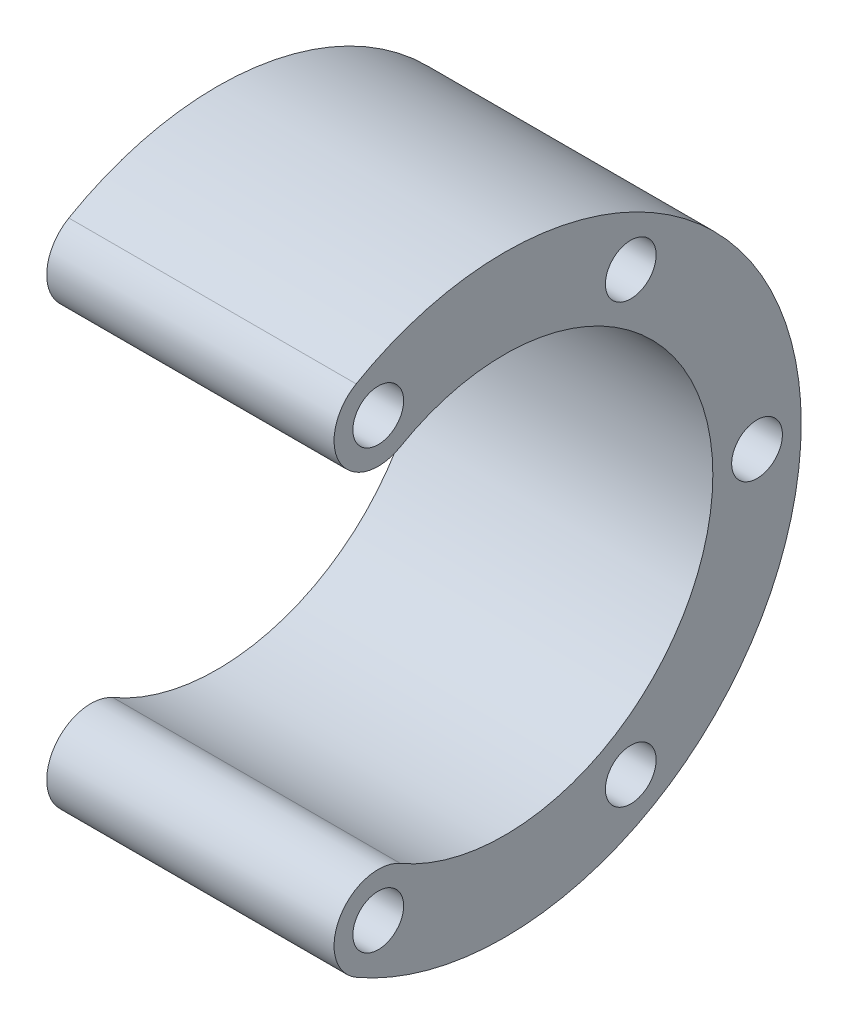
ISO-10303-21;
HEADER;
FILE_DESCRIPTION(('STEP AP214'),'2;1');
FILE_NAME('part.step','',(''),(''),'','','');
FILE_SCHEMA(('AUTOMOTIVE_DESIGN { 1 0 10303 214 1 1 1 1 }'));
ENDSEC;
DATA;
#1=APPLICATION_CONTEXT('core data for automotive mechanical design processes');
#2=APPLICATION_PROTOCOL_DEFINITION('international standard','automotive_design',2000,#1);
#3=PRODUCT_CONTEXT('',#1,'mechanical');
#4=PRODUCT('Part','Part','',(#3));
#5=PRODUCT_RELATED_PRODUCT_CATEGORY('part','',(#4));
#6=PRODUCT_DEFINITION_FORMATION('','',#4);
#7=PRODUCT_DEFINITION_CONTEXT('part definition',#1,'design');
#8=PRODUCT_DEFINITION('design','',#6,#7);
#9=PRODUCT_DEFINITION_SHAPE('','',#8);
#10=(LENGTH_UNIT() NAMED_UNIT(*) SI_UNIT(.MILLI.,.METRE.));
#11=(NAMED_UNIT(*) PLANE_ANGLE_UNIT() SI_UNIT($,.RADIAN.));
#12=(NAMED_UNIT(*) SI_UNIT($,.STERADIAN.) SOLID_ANGLE_UNIT());
#13=UNCERTAINTY_MEASURE_WITH_UNIT(LENGTH_MEASURE(1.E-05),#10,'distance_accuracy_value','');
#14=(GEOMETRIC_REPRESENTATION_CONTEXT(3) GLOBAL_UNCERTAINTY_ASSIGNED_CONTEXT((#13)) GLOBAL_UNIT_ASSIGNED_CONTEXT((#10,
#11,#12)) REPRESENTATION_CONTEXT('',''));
#15=CARTESIAN_POINT('',(0.,0.,0.));
#16=DIRECTION('',(0.,0.,1.));
#17=DIRECTION('',(1.,0.,0.));
#18=AXIS2_PLACEMENT_3D('',#15,#16,#17);
#19=CARTESIAN_POINT('',(285.75,300.961950573943,366.715339333629));
#20=DIRECTION('',(-1.,0.,0.));
#21=DIRECTION('',(0.,-1.,0.));
#22=AXIS2_PLACEMENT_3D('',#19,#20,#21);
#23=PLANE('',#22);
#24=CARTESIAN_POINT('',(285.75,279.691454743875,317.765339333629));
#25=DIRECTION('',(-1.,0.,0.));
#26=DIRECTION('',(0.,-1.,0.));
#27=AXIS2_PLACEMENT_3D('',#24,#25,#26);
#28=CIRCLE('',#27,2.5527);
#29=CARTESIAN_POINT('',(285.75,277.138754743875,317.765339333629));
#30=VERTEX_POINT('',#29);
#31=EDGE_CURVE('E136',#30,#30,#28,.F.);
#32=ORIENTED_EDGE('',*,*,#31,.T.);
#33=EDGE_LOOP('',(#32));
#34=FACE_BOUND('',#33,.T.);
#35=CARTESIAN_POINT('',(285.75,323.685545256125,343.165339333629));
#36=DIRECTION('',(-1.,0.,0.));
#37=DIRECTION('',(0.,-1.,0.));
#38=AXIS2_PLACEMENT_3D('',#35,#36,#37);
#39=CIRCLE('',#38,2.5527);
#40=CARTESIAN_POINT('',(285.75,321.132845256124,343.165339333629));
#41=VERTEX_POINT('',#40);
#42=EDGE_CURVE('E144',#41,#41,#39,.F.);
#43=ORIENTED_EDGE('',*,*,#42,.T.);
#44=EDGE_LOOP('',(#43));
#45=FACE_BOUND('',#44,.T.);
#46=CARTESIAN_POINT('',(285.75,279.691454743875,343.165339333629));
#47=DIRECTION('',(-1.,0.,0.));
#48=DIRECTION('',(0.,-1.,0.));
#49=AXIS2_PLACEMENT_3D('',#46,#47,#48);
#50=CIRCLE('',#49,2.5527);
#51=CARTESIAN_POINT('',(285.75,277.138754743875,343.165339333629));
#52=VERTEX_POINT('',#51);
#53=EDGE_CURVE('E125',#52,#52,#50,.F.);
#54=ORIENTED_EDGE('',*,*,#53,.T.);
#55=EDGE_LOOP('',(#54));
#56=FACE_BOUND('',#55,.T.);
#57=CARTESIAN_POINT('',(285.75,323.685545256125,343.165339333629));
#58=DIRECTION('',(-1.,0.,0.));
#59=DIRECTION('',(0.,-1.,0.));
#60=AXIS2_PLACEMENT_3D('',#57,#58,#59);
#61=CIRCLE('',#60,4.445);
#62=CARTESIAN_POINT('',(285.75,327.535028175946,345.387839333629));
#63=VERTEX_POINT('',#62);
#64=CARTESIAN_POINT('',(285.75,319.836062336302,340.942839333629));
#65=VERTEX_POINT('',#64);
#66=EDGE_CURVE('E131',#63,#65,#61,.F.);
#67=ORIENTED_EDGE('',*,*,#66,.F.);
#68=CARTESIAN_POINT('',(285.75,301.6885,330.465339333629));
#69=DIRECTION('',(-1.,0.,0.));
#70=DIRECTION('',(0.,-1.,0.));
#71=AXIS2_PLACEMENT_3D('',#68,#69,#70);
#72=CIRCLE('',#71,29.845);
#73=CARTESIAN_POINT('',(285.75,275.841971824053,345.387839333629));
#74=VERTEX_POINT('',#73);
#75=EDGE_CURVE('E92',#63,#74,#72,.T.);
#76=ORIENTED_EDGE('',*,*,#75,.T.);
#77=CARTESIAN_POINT('',(285.75,279.691454743875,343.165339333629));
#78=DIRECTION('',(-1.,0.,0.));
#79=DIRECTION('',(0.,-1.,0.));
#80=AXIS2_PLACEMENT_3D('',#77,#78,#79);
#81=CIRCLE('',#80,4.44499999999995);
#82=CARTESIAN_POINT('',(285.75,283.540937663696,340.942839333629));
#83=VERTEX_POINT('',#82);
#84=EDGE_CURVE('E128',#83,#74,#81,.F.);
#85=ORIENTED_EDGE('',*,*,#84,.F.);
#86=CARTESIAN_POINT('',(285.75,301.6885,330.465339333629));
#87=DIRECTION('',(-1.,0.,0.));
#88=DIRECTION('',(0.,-1.,0.));
#89=AXIS2_PLACEMENT_3D('',#86,#87,#88);
#90=CIRCLE('',#89,20.955);
#91=EDGE_CURVE('E61',#65,#83,#90,.T.);
#92=ORIENTED_EDGE('',*,*,#91,.F.);
#93=EDGE_LOOP('',(#67,#76,#85,#92));
#94=FACE_BOUND('',#93,.T.);
#95=CARTESIAN_POINT('',(285.75,301.6885,305.065339333629));
#96=DIRECTION('',(-1.,0.,0.));
#97=DIRECTION('',(0.,-1.,0.));
#98=AXIS2_PLACEMENT_3D('',#95,#96,#97);
#99=CIRCLE('',#98,2.5527);
#100=CARTESIAN_POINT('',(285.75,299.1358,305.065339333629));
#101=VERTEX_POINT('',#100);
#102=EDGE_CURVE('E148',#101,#101,#99,.F.);
#103=ORIENTED_EDGE('',*,*,#102,.T.);
#104=EDGE_LOOP('',(#103));
#105=FACE_BOUND('',#104,.T.);
#106=CARTESIAN_POINT('',(285.75,323.685545256125,317.765339333629));
#107=DIRECTION('',(-1.,0.,0.));
#108=DIRECTION('',(0.,-1.,0.));
#109=AXIS2_PLACEMENT_3D('',#106,#107,#108);
#110=CIRCLE('',#109,2.5527);
#111=CARTESIAN_POINT('',(285.75,321.132845256124,317.765339333629));
#112=VERTEX_POINT('',#111);
#113=EDGE_CURVE('E140',#112,#112,#110,.F.);
#114=ORIENTED_EDGE('',*,*,#113,.T.);
#115=EDGE_LOOP('',(#114));
#116=FACE_BOUND('',#115,.T.);
#117=ADVANCED_FACE('F45',(#34,#45,#56,#94,#105,#116),#23,.T.);
#118=CARTESIAN_POINT('',(285.748,301.6885,330.465339333629));
#119=DIRECTION('',(1.,0.,0.));
#120=DIRECTION('',(0.,1.,0.));
#121=AXIS2_PLACEMENT_3D('',#118,#119,#120);
#122=CYLINDRICAL_SURFACE('',#121,29.845);
#123=ORIENTED_EDGE('',*,*,#75,.F.);
#124=DIRECTION('',(1.,0.,0.));
#125=VECTOR('',#124,1.);
#126=CARTESIAN_POINT('',(285.748,327.535028175946,345.387839333629));
#127=LINE('',#126,#125);
#128=CARTESIAN_POINT('',(314.65,327.535028175946,345.387839333629));
#129=VERTEX_POINT('',#128);
#130=EDGE_CURVE('E85',#63,#129,#127,.T.);
#131=ORIENTED_EDGE('',*,*,#130,.T.);
#132=CARTESIAN_POINT('',(314.65,301.6885,330.465339333629));
#133=DIRECTION('',(1.,0.,0.));
#134=DIRECTION('',(0.,1.,0.));
#135=AXIS2_PLACEMENT_3D('',#132,#133,#134);
#136=CIRCLE('',#135,29.8449999999999);
#137=CARTESIAN_POINT('',(314.65,275.841971824053,345.387839333629));
#138=VERTEX_POINT('',#137);
#139=EDGE_CURVE('E90',#138,#129,#136,.T.);
#140=ORIENTED_EDGE('',*,*,#139,.F.);
#141=DIRECTION('',(1.,0.,0.));
#142=VECTOR('',#141,1.);
#143=CARTESIAN_POINT('',(285.748,275.841971824053,345.387839333629));
#144=LINE('',#143,#142);
#145=EDGE_CURVE('E95',#74,#138,#144,.T.);
#146=ORIENTED_EDGE('',*,*,#145,.F.);
#147=EDGE_LOOP('',(#123,#131,#140,#146));
#148=FACE_BOUND('',#147,.T.);
#149=ADVANCED_FACE('F87',(#148),#122,.T.);
#150=CARTESIAN_POINT('',(285.748,279.691454743875,343.165339333629));
#151=DIRECTION('',(1.,0.,0.));
#152=DIRECTION('',(0.,1.,0.));
#153=AXIS2_PLACEMENT_3D('',#150,#151,#152);
#154=CYLINDRICAL_SURFACE('',#153,4.44499999999995);
#155=DIRECTION('',(1.,0.,0.));
#156=VECTOR('',#155,1.);
#157=CARTESIAN_POINT('',(285.748,283.540937663696,340.942839333629));
#158=LINE('',#157,#156);
#159=CARTESIAN_POINT('',(314.65,283.540937663697,340.942839333629));
#160=VERTEX_POINT('',#159);
#161=EDGE_CURVE('E54',#83,#160,#158,.T.);
#162=ORIENTED_EDGE('',*,*,#161,.F.);
#163=ORIENTED_EDGE('',*,*,#84,.T.);
#164=ORIENTED_EDGE('',*,*,#145,.T.);
#165=CARTESIAN_POINT('',(314.65,279.691454743875,343.165339333629));
#166=DIRECTION('',(1.,0.,0.));
#167=DIRECTION('',(0.,1.,0.));
#168=AXIS2_PLACEMENT_3D('',#165,#166,#167);
#169=CIRCLE('',#168,4.44500000000001);
#170=EDGE_CURVE('E110',#160,#138,#169,.T.);
#171=ORIENTED_EDGE('',*,*,#170,.F.);
#172=EDGE_LOOP('',(#162,#163,#164,#171));
#173=FACE_BOUND('',#172,.T.);
#174=ADVANCED_FACE('F159',(#173),#154,.T.);
#175=CARTESIAN_POINT('',(285.748,323.685545256125,343.165339333629));
#176=DIRECTION('',(1.,0.,0.));
#177=DIRECTION('',(0.,1.,0.));
#178=AXIS2_PLACEMENT_3D('',#175,#176,#177);
#179=CYLINDRICAL_SURFACE('',#178,4.445);
#180=ORIENTED_EDGE('',*,*,#130,.F.);
#181=ORIENTED_EDGE('',*,*,#66,.T.);
#182=DIRECTION('',(1.,0.,0.));
#183=VECTOR('',#182,1.);
#184=CARTESIAN_POINT('',(285.748,319.836062336302,340.942839333629));
#185=LINE('',#184,#183);
#186=CARTESIAN_POINT('',(314.65,319.836062336303,340.942839333629));
#187=VERTEX_POINT('',#186);
#188=EDGE_CURVE('E11',#65,#187,#185,.T.);
#189=ORIENTED_EDGE('',*,*,#188,.T.);
#190=CARTESIAN_POINT('',(314.65,323.685545256125,343.165339333629));
#191=DIRECTION('',(1.,0.,0.));
#192=DIRECTION('',(0.,1.,0.));
#193=AXIS2_PLACEMENT_3D('',#190,#191,#192);
#194=CIRCLE('',#193,4.44499999999994);
#195=EDGE_CURVE('E98',#129,#187,#194,.T.);
#196=ORIENTED_EDGE('',*,*,#195,.F.);
#197=EDGE_LOOP('',(#180,#181,#189,#196));
#198=FACE_BOUND('',#197,.T.);
#199=ADVANCED_FACE('F99',(#198),#179,.T.);
#200=CARTESIAN_POINT('',(285.748,301.6885,330.465339333629));
#201=DIRECTION('',(1.,0.,0.));
#202=DIRECTION('',(0.,1.,0.));
#203=AXIS2_PLACEMENT_3D('',#200,#201,#202);
#204=CYLINDRICAL_SURFACE('',#203,20.955);
#205=ORIENTED_EDGE('',*,*,#188,.F.);
#206=ORIENTED_EDGE('',*,*,#91,.T.);
#207=ORIENTED_EDGE('',*,*,#161,.T.);
#208=CARTESIAN_POINT('',(314.65,301.6885,330.465339333629));
#209=DIRECTION('',(-1.,0.,0.));
#210=DIRECTION('',(0.,1.,0.));
#211=AXIS2_PLACEMENT_3D('',#208,#209,#210);
#212=CIRCLE('',#211,20.955);
#213=EDGE_CURVE('E104',#187,#160,#212,.T.);
#214=ORIENTED_EDGE('',*,*,#213,.F.);
#215=EDGE_LOOP('',(#205,#206,#207,#214));
#216=FACE_BOUND('',#215,.T.);
#217=ADVANCED_FACE('F47',(#216),#204,.F.);
#218=CARTESIAN_POINT('',(285.748,279.691454743875,343.165339333629));
#219=DIRECTION('',(1.,0.,0.));
#220=DIRECTION('',(0.,1.,0.));
#221=AXIS2_PLACEMENT_3D('',#218,#219,#220);
#222=CYLINDRICAL_SURFACE('',#221,2.5527);
#223=ORIENTED_EDGE('',*,*,#53,.F.);
#224=EDGE_LOOP('',(#223));
#225=FACE_BOUND('',#224,.T.);
#226=CARTESIAN_POINT('',(314.65,279.691454743875,343.165339333629));
#227=DIRECTION('',(1.,0.,0.));
#228=DIRECTION('',(0.,1.,0.));
#229=AXIS2_PLACEMENT_3D('',#226,#227,#228);
#230=CIRCLE('',#229,2.55270000000003);
#231=CARTESIAN_POINT('',(314.65,282.244154743875,343.165339333629));
#232=VERTEX_POINT('',#231);
#233=EDGE_CURVE('E112',#232,#232,#230,.T.);
#234=ORIENTED_EDGE('',*,*,#233,.T.);
#235=EDGE_LOOP('',(#234));
#236=FACE_BOUND('',#235,.T.);
#237=ADVANCED_FACE('F210',(#225,#236),#222,.F.);
#238=CARTESIAN_POINT('',(285.748,301.6885,305.065339333629));
#239=DIRECTION('',(1.,0.,0.));
#240=DIRECTION('',(0.,1.,0.));
#241=AXIS2_PLACEMENT_3D('',#238,#239,#240);
#242=CYLINDRICAL_SURFACE('',#241,2.5527);
#243=ORIENTED_EDGE('',*,*,#102,.F.);
#244=EDGE_LOOP('',(#243));
#245=FACE_BOUND('',#244,.T.);
#246=CARTESIAN_POINT('',(314.65,301.6885,305.065339333629));
#247=DIRECTION('',(1.,0.,0.));
#248=DIRECTION('',(0.,1.,0.));
#249=AXIS2_PLACEMENT_3D('',#246,#247,#248);
#250=CIRCLE('',#249,2.55270000000003);
#251=CARTESIAN_POINT('',(314.65,304.2412,305.065339333629));
#252=VERTEX_POINT('',#251);
#253=EDGE_CURVE('E179',#252,#252,#250,.T.);
#254=ORIENTED_EDGE('',*,*,#253,.T.);
#255=EDGE_LOOP('',(#254));
#256=FACE_BOUND('',#255,.T.);
#257=ADVANCED_FACE('F207',(#245,#256),#242,.F.);
#258=CARTESIAN_POINT('',(285.748,323.685545256125,343.165339333629));
#259=DIRECTION('',(1.,0.,0.));
#260=DIRECTION('',(0.,1.,0.));
#261=AXIS2_PLACEMENT_3D('',#258,#259,#260);
#262=CYLINDRICAL_SURFACE('',#261,2.5527);
#263=ORIENTED_EDGE('',*,*,#42,.F.);
#264=EDGE_LOOP('',(#263));
#265=FACE_BOUND('',#264,.T.);
#266=CARTESIAN_POINT('',(314.65,323.685545256125,343.165339333629));
#267=DIRECTION('',(1.,0.,0.));
#268=DIRECTION('',(0.,1.,0.));
#269=AXIS2_PLACEMENT_3D('',#266,#267,#268);
#270=CIRCLE('',#269,2.55270000000003);
#271=CARTESIAN_POINT('',(314.65,326.238245256125,343.165339333629));
#272=VERTEX_POINT('',#271);
#273=EDGE_CURVE('E180',#272,#272,#270,.T.);
#274=ORIENTED_EDGE('',*,*,#273,.T.);
#275=EDGE_LOOP('',(#274));
#276=FACE_BOUND('',#275,.T.);
#277=ADVANCED_FACE('F172',(#265,#276),#262,.F.);
#278=CARTESIAN_POINT('',(285.748,323.685545256125,317.765339333629));
#279=DIRECTION('',(1.,0.,0.));
#280=DIRECTION('',(0.,1.,0.));
#281=AXIS2_PLACEMENT_3D('',#278,#279,#280);
#282=CYLINDRICAL_SURFACE('',#281,2.5527);
#283=ORIENTED_EDGE('',*,*,#113,.F.);
#284=EDGE_LOOP('',(#283));
#285=FACE_BOUND('',#284,.T.);
#286=CARTESIAN_POINT('',(314.65,323.685545256125,317.765339333629));
#287=DIRECTION('',(1.,0.,0.));
#288=DIRECTION('',(0.,1.,0.));
#289=AXIS2_PLACEMENT_3D('',#286,#287,#288);
#290=CIRCLE('',#289,2.55270000000003);
#291=CARTESIAN_POINT('',(314.65,326.238245256125,317.765339333629));
#292=VERTEX_POINT('',#291);
#293=EDGE_CURVE('E176',#292,#292,#290,.T.);
#294=ORIENTED_EDGE('',*,*,#293,.T.);
#295=EDGE_LOOP('',(#294));
#296=FACE_BOUND('',#295,.T.);
#297=ADVANCED_FACE('F169',(#285,#296),#282,.F.);
#298=CARTESIAN_POINT('',(285.748,279.691454743875,317.765339333629));
#299=DIRECTION('',(1.,0.,0.));
#300=DIRECTION('',(0.,1.,0.));
#301=AXIS2_PLACEMENT_3D('',#298,#299,#300);
#302=CYLINDRICAL_SURFACE('',#301,2.5527);
#303=ORIENTED_EDGE('',*,*,#31,.F.);
#304=EDGE_LOOP('',(#303));
#305=FACE_BOUND('',#304,.T.);
#306=CARTESIAN_POINT('',(314.65,279.691454743875,317.765339333629));
#307=DIRECTION('',(1.,0.,0.));
#308=DIRECTION('',(0.,1.,0.));
#309=AXIS2_PLACEMENT_3D('',#306,#307,#308);
#310=CIRCLE('',#309,2.55270000000003);
#311=CARTESIAN_POINT('',(314.65,282.244154743875,317.765339333629));
#312=VERTEX_POINT('',#311);
#313=EDGE_CURVE('E118',#312,#312,#310,.T.);
#314=ORIENTED_EDGE('',*,*,#313,.T.);
#315=EDGE_LOOP('',(#314));
#316=FACE_BOUND('',#315,.T.);
#317=ADVANCED_FACE('F164',(#305,#316),#302,.F.);
#318=CARTESIAN_POINT('',(314.65,312.687022628062,336.815339333629));
#319=DIRECTION('',(1.,0.,0.));
#320=DIRECTION('',(0.,1.,0.));
#321=AXIS2_PLACEMENT_3D('',#318,#319,#320);
#322=PLANE('',#321);
#323=ORIENTED_EDGE('',*,*,#293,.F.);
#324=EDGE_LOOP('',(#323));
#325=FACE_BOUND('',#324,.T.);
#326=ORIENTED_EDGE('',*,*,#313,.F.);
#327=EDGE_LOOP('',(#326));
#328=FACE_BOUND('',#327,.T.);
#329=ORIENTED_EDGE('',*,*,#139,.T.);
#330=ORIENTED_EDGE('',*,*,#195,.T.);
#331=ORIENTED_EDGE('',*,*,#213,.T.);
#332=ORIENTED_EDGE('',*,*,#170,.T.);
#333=EDGE_LOOP('',(#329,#330,#331,#332));
#334=FACE_BOUND('',#333,.T.);
#335=ORIENTED_EDGE('',*,*,#233,.F.);
#336=EDGE_LOOP('',(#335));
#337=FACE_BOUND('',#336,.T.);
#338=ORIENTED_EDGE('',*,*,#253,.F.);
#339=EDGE_LOOP('',(#338));
#340=FACE_BOUND('',#339,.T.);
#341=ORIENTED_EDGE('',*,*,#273,.F.);
#342=EDGE_LOOP('',(#341));
#343=FACE_BOUND('',#342,.T.);
#344=ADVANCED_FACE('F107',(#325,#328,#334,#337,#340,#343),#322,.T.);
#345=CLOSED_SHELL('',(#117,#149,#174,#199,#217,#237,#257,#277,#297,#317,#344));
#346=MANIFOLD_SOLID_BREP('B2',#345);
#347=ADVANCED_BREP_SHAPE_REPRESENTATION('',(#18,#346),#14);
#348=SHAPE_DEFINITION_REPRESENTATION(#9,#347);
ENDSEC;
END-ISO-10303-21;
